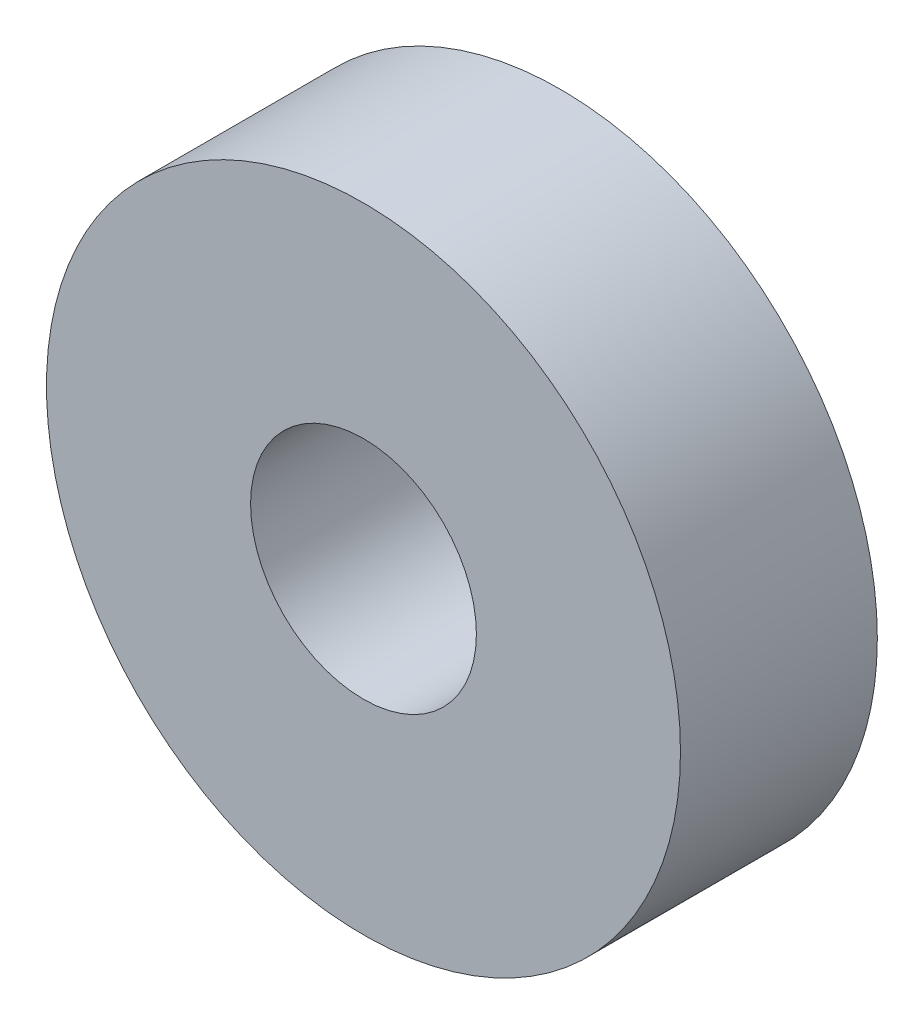
ISO-10303-21;
HEADER;
FILE_DESCRIPTION(('STEP AP214'),'2;1');
FILE_NAME('part.step','',(''),(''),'','','');
FILE_SCHEMA(('AUTOMOTIVE_DESIGN { 1 0 10303 214 1 1 1 1 }'));
ENDSEC;
DATA;
#1=APPLICATION_CONTEXT('core data for automotive mechanical design processes');
#2=APPLICATION_PROTOCOL_DEFINITION('international standard','automotive_design',2000,#1);
#3=PRODUCT_CONTEXT('',#1,'mechanical');
#4=PRODUCT('Part','Part','',(#3));
#5=PRODUCT_RELATED_PRODUCT_CATEGORY('part','',(#4));
#6=PRODUCT_DEFINITION_FORMATION('','',#4);
#7=PRODUCT_DEFINITION_CONTEXT('part definition',#1,'design');
#8=PRODUCT_DEFINITION('design','',#6,#7);
#9=PRODUCT_DEFINITION_SHAPE('','',#8);
#10=(LENGTH_UNIT() NAMED_UNIT(*) SI_UNIT(.MILLI.,.METRE.));
#11=(NAMED_UNIT(*) PLANE_ANGLE_UNIT() SI_UNIT($,.RADIAN.));
#12=(NAMED_UNIT(*) SI_UNIT($,.STERADIAN.) SOLID_ANGLE_UNIT());
#13=UNCERTAINTY_MEASURE_WITH_UNIT(LENGTH_MEASURE(1.E-05),#10,'distance_accuracy_value','');
#14=(GEOMETRIC_REPRESENTATION_CONTEXT(3) GLOBAL_UNCERTAINTY_ASSIGNED_CONTEXT((#13)) GLOBAL_UNIT_ASSIGNED_CONTEXT((#10,
#11,#12)) REPRESENTATION_CONTEXT('',''));
#15=CARTESIAN_POINT('',(0.,0.,0.));
#16=DIRECTION('',(0.,0.,1.));
#17=DIRECTION('',(1.,0.,0.));
#18=AXIS2_PLACEMENT_3D('',#15,#16,#17);
#19=CARTESIAN_POINT('',(0.,0.,-3.4));
#20=DIRECTION('',(0.,0.,1.));
#21=DIRECTION('',(1.,0.,0.));
#22=AXIS2_PLACEMENT_3D('',#19,#20,#21);
#23=CYLINDRICAL_SURFACE('',#22,10.95);
#24=CARTESIAN_POINT('',(0.,0.,-3.4));
#25=DIRECTION('',(0.,0.,1.));
#26=DIRECTION('',(1.,0.,0.));
#27=AXIS2_PLACEMENT_3D('',#24,#25,#26);
#28=CIRCLE('',#27,10.95);
#29=CARTESIAN_POINT('',(10.95,0.,-3.4));
#30=VERTEX_POINT('',#29);
#31=EDGE_CURVE('E37',#30,#30,#28,.T.);
#32=ORIENTED_EDGE('',*,*,#31,.T.);
#33=EDGE_LOOP('',(#32));
#34=FACE_BOUND('',#33,.T.);
#35=CARTESIAN_POINT('',(0.,0.,3.4));
#36=DIRECTION('',(0.,0.,1.));
#37=DIRECTION('',(1.,0.,0.));
#38=AXIS2_PLACEMENT_3D('',#35,#36,#37);
#39=CIRCLE('',#38,10.95);
#40=CARTESIAN_POINT('',(10.95,0.,3.4));
#41=VERTEX_POINT('',#40);
#42=EDGE_CURVE('E45',#41,#41,#39,.T.);
#43=ORIENTED_EDGE('',*,*,#42,.F.);
#44=EDGE_LOOP('',(#43));
#45=FACE_BOUND('',#44,.T.);
#46=ADVANCED_FACE('F31',(#34,#45),#23,.T.);
#47=CARTESIAN_POINT('',(0.,0.,-3.4));
#48=DIRECTION('',(0.,0.,1.));
#49=DIRECTION('',(1.,0.,0.));
#50=AXIS2_PLACEMENT_3D('',#47,#48,#49);
#51=CYLINDRICAL_SURFACE('',#50,3.9);
#52=CARTESIAN_POINT('',(0.,0.,-3.4));
#53=DIRECTION('',(0.,0.,1.));
#54=DIRECTION('',(1.,0.,0.));
#55=AXIS2_PLACEMENT_3D('',#52,#53,#54);
#56=CIRCLE('',#55,3.9);
#57=CARTESIAN_POINT('',(3.9,0.,-3.4));
#58=VERTEX_POINT('',#57);
#59=EDGE_CURVE('E10',#58,#58,#56,.T.);
#60=ORIENTED_EDGE('',*,*,#59,.F.);
#61=EDGE_LOOP('',(#60));
#62=FACE_BOUND('',#61,.T.);
#63=CARTESIAN_POINT('',(0.,0.,3.4));
#64=DIRECTION('',(0.,0.,1.));
#65=DIRECTION('',(1.,0.,0.));
#66=AXIS2_PLACEMENT_3D('',#63,#64,#65);
#67=CIRCLE('',#66,3.9);
#68=CARTESIAN_POINT('',(3.9,0.,3.4));
#69=VERTEX_POINT('',#68);
#70=EDGE_CURVE('E41',#69,#69,#67,.T.);
#71=ORIENTED_EDGE('',*,*,#70,.T.);
#72=EDGE_LOOP('',(#71));
#73=FACE_BOUND('',#72,.T.);
#74=ADVANCED_FACE('F55',(#62,#73),#51,.F.);
#75=CARTESIAN_POINT('',(0.,-24.2314213562373,-3.4));
#76=DIRECTION('',(0.,0.,1.));
#77=DIRECTION('',(1.,0.,0.));
#78=AXIS2_PLACEMENT_3D('',#75,#76,#77);
#79=PLANE('',#78);
#80=ORIENTED_EDGE('',*,*,#31,.F.);
#81=EDGE_LOOP('',(#80));
#82=FACE_BOUND('',#81,.T.);
#83=ORIENTED_EDGE('',*,*,#59,.T.);
#84=EDGE_LOOP('',(#83));
#85=FACE_BOUND('',#84,.T.);
#86=ADVANCED_FACE('F59',(#82,#85),#79,.F.);
#87=CARTESIAN_POINT('',(0.,-24.2314213562373,3.4));
#88=DIRECTION('',(0.,0.,1.));
#89=DIRECTION('',(1.,0.,0.));
#90=AXIS2_PLACEMENT_3D('',#87,#88,#89);
#91=PLANE('',#90);
#92=ORIENTED_EDGE('',*,*,#42,.T.);
#93=EDGE_LOOP('',(#92));
#94=FACE_BOUND('',#93,.T.);
#95=ORIENTED_EDGE('',*,*,#70,.F.);
#96=EDGE_LOOP('',(#95));
#97=FACE_BOUND('',#96,.T.);
#98=ADVANCED_FACE('F51',(#94,#97),#91,.T.);
#99=CLOSED_SHELL('',(#46,#74,#86,#98));
#100=MANIFOLD_SOLID_BREP('B2',#99);
#101=ADVANCED_BREP_SHAPE_REPRESENTATION('',(#18,#100),#14);
#102=SHAPE_DEFINITION_REPRESENTATION(#9,#101);
ENDSEC;
END-ISO-10303-21;
